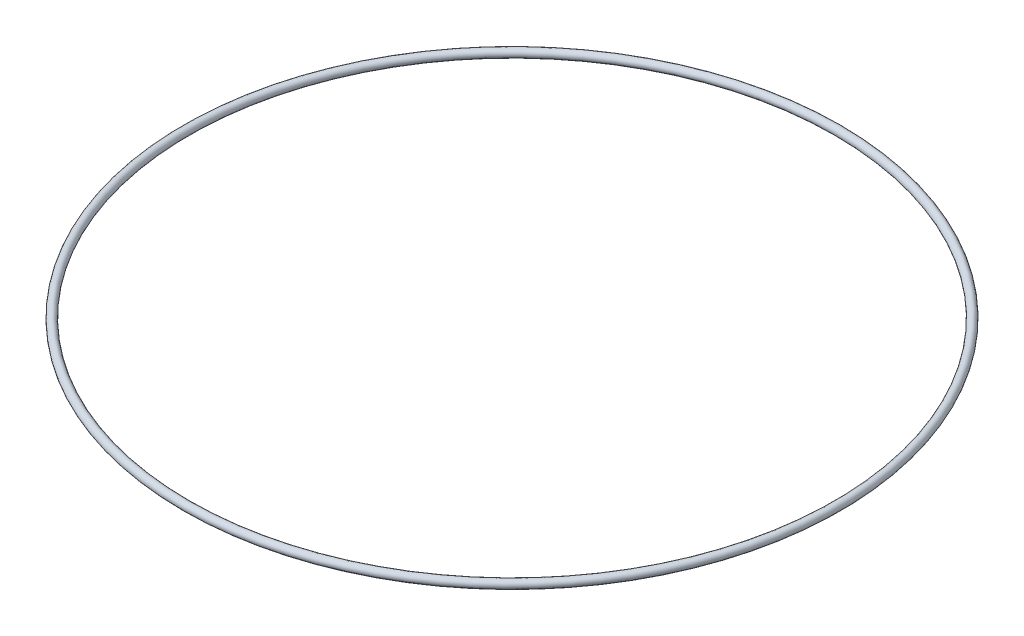
ISO-10303-21;
HEADER;
FILE_DESCRIPTION(('STEP AP214'),'2;1');
FILE_NAME('part.step','',(''),(''),'','','');
FILE_SCHEMA(('AUTOMOTIVE_DESIGN { 1 0 10303 214 1 1 1 1 }'));
ENDSEC;
DATA;
#1=APPLICATION_CONTEXT('core data for automotive mechanical design processes');
#2=APPLICATION_PROTOCOL_DEFINITION('international standard','automotive_design',2000,#1);
#3=PRODUCT_CONTEXT('',#1,'mechanical');
#4=PRODUCT('Part','Part','',(#3));
#5=PRODUCT_RELATED_PRODUCT_CATEGORY('part','',(#4));
#6=PRODUCT_DEFINITION_FORMATION('','',#4);
#7=PRODUCT_DEFINITION_CONTEXT('part definition',#1,'design');
#8=PRODUCT_DEFINITION('design','',#6,#7);
#9=PRODUCT_DEFINITION_SHAPE('','',#8);
#10=(LENGTH_UNIT() NAMED_UNIT(*) SI_UNIT(.MILLI.,.METRE.));
#11=(NAMED_UNIT(*) PLANE_ANGLE_UNIT() SI_UNIT($,.RADIAN.));
#12=(NAMED_UNIT(*) SI_UNIT($,.STERADIAN.) SOLID_ANGLE_UNIT());
#13=UNCERTAINTY_MEASURE_WITH_UNIT(LENGTH_MEASURE(1.E-05),#10,'distance_accuracy_value','');
#14=(GEOMETRIC_REPRESENTATION_CONTEXT(3) GLOBAL_UNCERTAINTY_ASSIGNED_CONTEXT((#13)) GLOBAL_UNIT_ASSIGNED_CONTEXT((#10,
#11,#12)) REPRESENTATION_CONTEXT('',''));
#15=CARTESIAN_POINT('',(0.,0.,0.));
#16=DIRECTION('',(0.,0.,1.));
#17=DIRECTION('',(1.,0.,0.));
#18=AXIS2_PLACEMENT_3D('',#15,#16,#17);
#19=CARTESIAN_POINT('',(0.,0.,0.));
#20=DIRECTION('',(0.,-1.,0.));
#21=DIRECTION('',(0.,0.,-1.));
#22=AXIS2_PLACEMENT_3D('',#19,#20,#21);
#23=TOROIDAL_SURFACE('',#22,19.75,0.25);
#24=CARTESIAN_POINT('',(0.,0.,-20.));
#25=VERTEX_POINT('',#24);
#26=VERTEX_LOOP('',#25);
#27=FACE_BOUND('',#26,.T.);
#28=ADVANCED_FACE('F37',(#27),#23,.T.);
#29=CLOSED_SHELL('',(#28));
#30=MANIFOLD_SOLID_BREP('B2',#29);
#31=ADVANCED_BREP_SHAPE_REPRESENTATION('',(#18,#30),#14);
#32=SHAPE_DEFINITION_REPRESENTATION(#9,#31);
ENDSEC;
END-ISO-10303-21;
